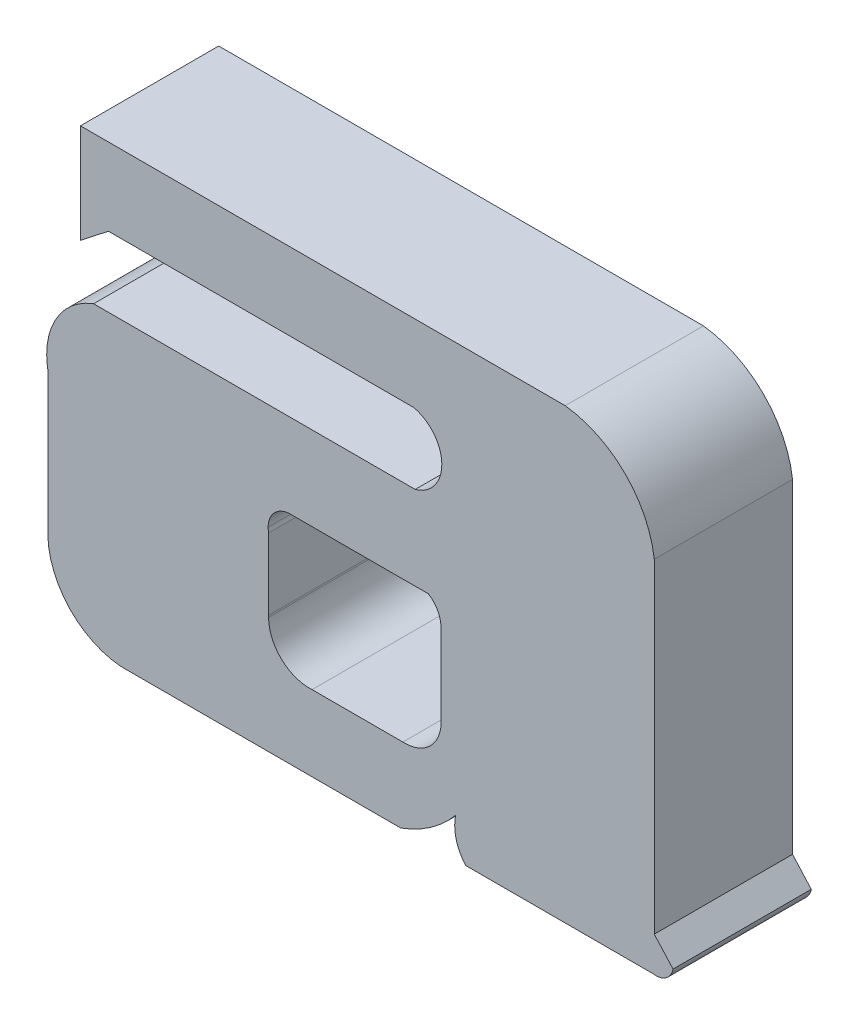
ISO-10303-21;
HEADER;
FILE_DESCRIPTION(('STEP AP214'),'2;1');
FILE_NAME('part.step','',(''),(''),'','','');
FILE_SCHEMA(('AUTOMOTIVE_DESIGN { 1 0 10303 214 1 1 1 1 }'));
ENDSEC;
DATA;
#1=APPLICATION_CONTEXT('core data for automotive mechanical design processes');
#2=APPLICATION_PROTOCOL_DEFINITION('international standard','automotive_design',2000,#1);
#3=PRODUCT_CONTEXT('',#1,'mechanical');
#4=PRODUCT('Part','Part','',(#3));
#5=PRODUCT_RELATED_PRODUCT_CATEGORY('part','',(#4));
#6=PRODUCT_DEFINITION_FORMATION('','',#4);
#7=PRODUCT_DEFINITION_CONTEXT('part definition',#1,'design');
#8=PRODUCT_DEFINITION('design','',#6,#7);
#9=PRODUCT_DEFINITION_SHAPE('','',#8);
#10=(LENGTH_UNIT() NAMED_UNIT(*) SI_UNIT(.MILLI.,.METRE.));
#11=(NAMED_UNIT(*) PLANE_ANGLE_UNIT() SI_UNIT($,.RADIAN.));
#12=(NAMED_UNIT(*) SI_UNIT($,.STERADIAN.) SOLID_ANGLE_UNIT());
#13=UNCERTAINTY_MEASURE_WITH_UNIT(LENGTH_MEASURE(1.E-05),#10,'distance_accuracy_value','');
#14=(GEOMETRIC_REPRESENTATION_CONTEXT(3) GLOBAL_UNCERTAINTY_ASSIGNED_CONTEXT((#13)) GLOBAL_UNIT_ASSIGNED_CONTEXT((#10,
#11,#12)) REPRESENTATION_CONTEXT('',''));
#15=CARTESIAN_POINT('',(0.,0.,0.));
#16=DIRECTION('',(0.,0.,1.));
#17=DIRECTION('',(1.,0.,0.));
#18=AXIS2_PLACEMENT_3D('',#15,#16,#17);
#19=CARTESIAN_POINT('',(-7.09371392000624,-18.2563641067006,69.4720552155059));
#20=DIRECTION('',(0.,0.,1.));
#21=DIRECTION('',(1.,0.,0.));
#22=AXIS2_PLACEMENT_3D('',#19,#20,#21);
#23=PLANE('',#22);
#24=DIRECTION('',(0.,-1.,0.));
#25=VECTOR('',#24,1.);
#26=CARTESIAN_POINT('',(-6.70005694437426,-17.949114577861,69.4720552155059));
#27=LINE('',#26,#25);
#28=CARTESIAN_POINT('',(-6.70005694437426,-17.949114577861,69.4720552155059));
#29=VERTEX_POINT('',#28);
#30=CARTESIAN_POINT('',(-6.70005694437426,-18.1478077512587,69.4720552155059));
#31=VERTEX_POINT('',#30);
#32=EDGE_CURVE('E249',#29,#31,#27,.T.);
#33=ORIENTED_EDGE('',*,*,#32,.T.);
#34=CARTESIAN_POINT('',(-6.58623628049664,-18.1528860307222,69.4720552155059));
#35=DIRECTION('',(0.,0.,1.));
#36=DIRECTION('',(1.,0.,0.));
#37=AXIS2_PLACEMENT_3D('',#34,#35,#36);
#38=CIRCLE('',#37,0.113933895078589);
#39=CARTESIAN_POINT('',(-6.70017017557523,-18.1528860307222,69.4720552155059));
#40=VERTEX_POINT('',#39);
#41=EDGE_CURVE('E499',#31,#40,#38,.T.);
#42=ORIENTED_EDGE('',*,*,#41,.T.);
#43=CARTESIAN_POINT('',(-6.58623628049664,-18.1528860307222,69.4720552155059));
#44=DIRECTION('',(0.,0.,1.));
#45=DIRECTION('',(1.,0.,0.));
#46=AXIS2_PLACEMENT_3D('',#43,#44,#45);
#47=CIRCLE('',#46,0.113933895078589);
#48=CARTESIAN_POINT('',(-6.57902837618529,-18.2665916970859,69.4720552155059));
#49=VERTEX_POINT('',#48);
#50=EDGE_CURVE('E11',#40,#49,#47,.T.);
#51=ORIENTED_EDGE('',*,*,#50,.T.);
#52=DIRECTION('',(1.,0.,0.));
#53=VECTOR('',#52,1.);
#54=CARTESIAN_POINT('',(-6.57902837618762,-18.2665916970863,69.4720552155059));
#55=LINE('',#54,#53);
#56=CARTESIAN_POINT('',(-6.32616518125116,-18.2665916970863,69.4720552155059));
#57=VERTEX_POINT('',#56);
#58=EDGE_CURVE('E268',#49,#57,#55,.T.);
#59=ORIENTED_EDGE('',*,*,#58,.T.);
#60=CARTESIAN_POINT('',(-6.32099396991315,-18.1653853424284,69.4720552155059));
#61=DIRECTION('',(0.,0.,1.));
#62=DIRECTION('',(1.,0.,0.));
#63=AXIS2_PLACEMENT_3D('',#60,#61,#62);
#64=CIRCLE('',#63,0.101338381918715);
#65=CARTESIAN_POINT('',(-6.22026516873313,-18.1542868622287,69.4720552155059));
#66=VERTEX_POINT('',#65);
#67=EDGE_CURVE('E318',#57,#66,#64,.T.);
#68=ORIENTED_EDGE('',*,*,#67,.T.);
#69=DIRECTION('',(0.,1.,0.));
#70=VECTOR('',#69,1.);
#71=CARTESIAN_POINT('',(-6.22026516873344,-18.1542868622284,69.4720552155059));
#72=LINE('',#71,#70);
#73=CARTESIAN_POINT('',(-6.22026516873344,-17.9404757282745,69.4720552155059));
#74=VERTEX_POINT('',#73);
#75=EDGE_CURVE('E308',#66,#74,#72,.T.);
#76=ORIENTED_EDGE('',*,*,#75,.T.);
#77=CARTESIAN_POINT('',(-6.29342149349179,-17.9361766300931,69.4720552155059));
#78=DIRECTION('',(0.,0.,1.));
#79=DIRECTION('',(1.,0.,0.));
#80=AXIS2_PLACEMENT_3D('',#77,#78,#79);
#81=CIRCLE('',#80,0.073282536101095);
#82=CARTESIAN_POINT('',(-6.25543822245236,-17.8735060531167,69.4720552155059));
#83=VERTEX_POINT('',#82);
#84=EDGE_CURVE('E292',#74,#83,#81,.T.);
#85=ORIENTED_EDGE('',*,*,#84,.T.);
#86=DIRECTION('',(-1.,0.,0.));
#87=VECTOR('',#86,1.);
#88=CARTESIAN_POINT('',(-6.25543822245267,-17.8735060531178,69.4720552155059));
#89=LINE('',#88,#87);
#90=CARTESIAN_POINT('',(-6.63422013666626,-17.8735060531178,69.4720552155059));
#91=VERTEX_POINT('',#90);
#92=EDGE_CURVE('E276',#83,#91,#89,.T.);
#93=ORIENTED_EDGE('',*,*,#92,.T.);
#94=CARTESIAN_POINT('',(-6.63863681625541,-17.9361284500337,69.4720552155059));
#95=DIRECTION('',(0.,0.,1.));
#96=DIRECTION('',(1.,0.,0.));
#97=AXIS2_PLACEMENT_3D('',#94,#95,#96);
#98=CIRCLE('',#97,0.0627779551599789);
#99=CARTESIAN_POINT('',(-6.70141477141539,-17.9361284500337,69.4720552155059));
#100=VERTEX_POINT('',#99);
#101=EDGE_CURVE('E509',#91,#100,#98,.T.);
#102=ORIENTED_EDGE('',*,*,#101,.T.);
#103=CARTESIAN_POINT('',(-6.63863681625541,-17.9361284500337,69.4720552155059));
#104=DIRECTION('',(0.,0.,1.));
#105=DIRECTION('',(1.,0.,0.));
#106=AXIS2_PLACEMENT_3D('',#103,#104,#105);
#107=CIRCLE('',#106,0.0627779551599789);
#108=EDGE_CURVE('E213',#100,#29,#107,.T.);
#109=ORIENTED_EDGE('',*,*,#108,.T.);
#110=EDGE_LOOP('',(#33,#42,#51,#59,#68,#76,#85,#93,#102,#109));
#111=FACE_BOUND('',#110,.T.);
#112=DIRECTION('',(0.,-1.,0.));
#113=VECTOR('',#112,1.);
#114=CARTESIAN_POINT('',(-7.31492985588913,-17.8625345620598,69.4720552155059));
#115=LINE('',#114,#113);
#116=CARTESIAN_POINT('',(-7.31492985588913,-17.8625345620598,69.4720552155059));
#117=VERTEX_POINT('',#116);
#118=CARTESIAN_POINT('',(-7.31492985588913,-18.2629938808058,69.4720552155059));
#119=VERTEX_POINT('',#118);
#120=EDGE_CURVE('E331',#117,#119,#115,.T.);
#121=ORIENTED_EDGE('',*,*,#120,.F.);
#122=CARTESIAN_POINT('',(-7.11852428682571,-17.8273742835004,69.4720552155059));
#123=DIRECTION('',(0.,0.,1.));
#124=DIRECTION('',(1.,0.,0.));
#125=AXIS2_PLACEMENT_3D('',#122,#123,#124);
#126=CIRCLE('',#125,0.199527924729331);
#127=CARTESIAN_POINT('',(-7.31805221155504,-17.8273742835004,69.4720552155059));
#128=VERTEX_POINT('',#127);
#129=EDGE_CURVE('E487',#128,#117,#126,.T.);
#130=ORIENTED_EDGE('',*,*,#129,.F.);
#131=CARTESIAN_POINT('',(-7.11852428682571,-17.8273742835004,69.4720552155059));
#132=DIRECTION('',(0.,0.,1.));
#133=DIRECTION('',(1.,0.,0.));
#134=AXIS2_PLACEMENT_3D('',#131,#132,#133);
#135=CIRCLE('',#134,0.199527924729331);
#136=CARTESIAN_POINT('',(-7.18748146758224,-17.6401410066266,69.4720552155059));
#137=VERTEX_POINT('',#136);
#138=EDGE_CURVE('E50',#137,#128,#135,.T.);
#139=ORIENTED_EDGE('',*,*,#138,.F.);
#140=DIRECTION('',(-1.,0.,0.));
#141=VECTOR('',#140,1.);
#142=CARTESIAN_POINT('',(-6.29181560652246,-17.6401410066266,69.4720552155059));
#143=LINE('',#142,#141);
#144=CARTESIAN_POINT('',(-6.29181560652199,-17.6401410066266,69.4720552155059));
#145=VERTEX_POINT('',#144);
#146=EDGE_CURVE('E178',#145,#137,#143,.T.);
#147=ORIENTED_EDGE('',*,*,#146,.F.);
#148=CARTESIAN_POINT('',(-6.31862845945879,-17.5428476392337,69.4720552155059));
#149=DIRECTION('',(0.,0.,-1.));
#150=DIRECTION('',(1.,0.,0.));
#151=AXIS2_PLACEMENT_3D('',#148,#149,#150);
#152=CIRCLE('',#151,0.100920406366913);
#153=CARTESIAN_POINT('',(-6.29524732166278,-17.4446730456946,69.4720552155059));
#154=VERTEX_POINT('',#153);
#155=EDGE_CURVE('E458',#154,#145,#152,.T.);
#156=ORIENTED_EDGE('',*,*,#155,.F.);
#157=DIRECTION('',(1.,0.,0.));
#158=VECTOR('',#157,1.);
#159=CARTESIAN_POINT('',(-7.14630137717123,-17.4446730456946,69.4720552155059));
#160=LINE('',#159,#158);
#161=CARTESIAN_POINT('',(-7.14630137717123,-17.4446730456946,69.4720552155059));
#162=VERTEX_POINT('',#161);
#163=EDGE_CURVE('E450',#162,#154,#160,.T.);
#164=ORIENTED_EDGE('',*,*,#163,.F.);
#165=DIRECTION('',(0.786213872145871,0.617954486386656,0.));
#166=VECTOR('',#165,1.);
#167=CARTESIAN_POINT('',(-7.22409146451037,-17.5058151027998,69.4720552155059));
#168=LINE('',#167,#166);
#169=CARTESIAN_POINT('',(-7.22409146451037,-17.5058151027998,69.4720552155059));
#170=VERTEX_POINT('',#169);
#171=EDGE_CURVE('E438',#170,#162,#168,.T.);
#172=ORIENTED_EDGE('',*,*,#171,.F.);
#173=DIRECTION('',(0.,-1.,0.));
#174=VECTOR('',#173,1.);
#175=CARTESIAN_POINT('',(-7.22409146451037,-17.2293455898983,69.4720552155059));
#176=LINE('',#175,#174);
#177=CARTESIAN_POINT('',(-7.22409146451037,-17.2293455898983,69.4720552155059));
#178=VERTEX_POINT('',#177);
#179=EDGE_CURVE('E429',#178,#170,#176,.T.);
#180=ORIENTED_EDGE('',*,*,#179,.F.);
#181=DIRECTION('',(-1.,0.,0.));
#182=VECTOR('',#181,1.);
#183=CARTESIAN_POINT('',(-5.87410051437969,-17.2293455898983,69.4720552155059));
#184=LINE('',#183,#182);
#185=CARTESIAN_POINT('',(-5.87410051437845,-17.229345589899,69.4720552155059));
#186=VERTEX_POINT('',#185);
#187=EDGE_CURVE('E417',#186,#178,#184,.T.);
#188=ORIENTED_EDGE('',*,*,#187,.F.);
#189=CARTESIAN_POINT('',(-5.9068699926172,-17.510395380675,69.4720552155059));
#190=DIRECTION('',(0.,0.,1.));
#191=DIRECTION('',(1.,0.,0.));
#192=AXIS2_PLACEMENT_3D('',#189,#190,#191);
#193=CIRCLE('',#192,0.282953748162626);
#194=CARTESIAN_POINT('',(-5.6260717122226,-17.4755363886252,69.4720552155059));
#195=VERTEX_POINT('',#194);
#196=EDGE_CURVE('E408',#195,#186,#193,.T.);
#197=ORIENTED_EDGE('',*,*,#196,.F.);
#198=DIRECTION('',(0.,1.,0.));
#199=VECTOR('',#198,1.);
#200=CARTESIAN_POINT('',(-5.6260717122226,-18.3178512836551,69.4720552155059));
#201=LINE('',#200,#199);
#202=CARTESIAN_POINT('',(-5.6260717122226,-18.3799109268185,69.4720552155059));
#203=VERTEX_POINT('',#202);
#204=EDGE_CURVE('E395',#203,#195,#201,.T.);
#205=ORIENTED_EDGE('',*,*,#204,.F.);
#206=DIRECTION('',(-0.668993054621241,0.743268654571509,0.));
#207=VECTOR('',#206,1.);
#208=CARTESIAN_POINT('',(-5.57378773528379,-18.4379997827887,69.4720552155059));
#209=LINE('',#208,#207);
#210=CARTESIAN_POINT('',(-5.5737877352813,-18.4379997827881,69.4720552155059));
#211=VERTEX_POINT('',#210);
#212=EDGE_CURVE('E300',#211,#203,#209,.T.);
#213=ORIENTED_EDGE('',*,*,#212,.F.);
#214=CARTESIAN_POINT('',(-5.62151652492824,-18.4290609792016,69.4720552155059));
#215=DIRECTION('',(0.,0.,1.));
#216=DIRECTION('',(1.,0.,0.));
#217=AXIS2_PLACEMENT_3D('',#214,#215,#216);
#218=CIRCLE('',#217,0.0485586199424548);
#219=CARTESIAN_POINT('',(-5.62962452360063,-18.476937904002,69.4720552155059));
#220=VERTEX_POINT('',#219);
#221=EDGE_CURVE('E384',#220,#211,#218,.T.);
#222=ORIENTED_EDGE('',*,*,#221,.F.);
#223=DIRECTION('',(1.,0.,0.));
#224=VECTOR('',#223,1.);
#225=CARTESIAN_POINT('',(-6.15113591884307,-18.476937904002,69.4720552155059));
#226=LINE('',#225,#224);
#227=CARTESIAN_POINT('',(-6.15113591884074,-18.4769379040006,69.4720552155059));
#228=VERTEX_POINT('',#227);
#229=EDGE_CURVE('E372',#228,#220,#226,.T.);
#230=ORIENTED_EDGE('',*,*,#229,.F.);
#231=CARTESIAN_POINT('',(-6.05953638076651,-18.3958561627307,69.4720552155059));
#232=DIRECTION('',(0.,0.,1.));
#233=DIRECTION('',(1.,0.,0.));
#234=AXIS2_PLACEMENT_3D('',#231,#232,#233);
#235=CIRCLE('',#234,0.122330389285578);
#236=CARTESIAN_POINT('',(-6.18186677005209,-18.3958561627307,69.4720552155059));
#237=VERTEX_POINT('',#236);
#238=EDGE_CURVE('E532',#237,#228,#235,.T.);
#239=ORIENTED_EDGE('',*,*,#238,.F.);
#240=CARTESIAN_POINT('',(-6.05953638076651,-18.3958561627307,69.4720552155059));
#241=DIRECTION('',(0.,0.,1.));
#242=DIRECTION('',(1.,0.,0.));
#243=AXIS2_PLACEMENT_3D('',#240,#241,#242);
#244=CIRCLE('',#243,0.122330389285578);
#245=CARTESIAN_POINT('',(-6.17895973508447,-18.3693460403971,69.4720552155059));
#246=VERTEX_POINT('',#245);
#247=EDGE_CURVE('E368',#246,#237,#244,.T.);
#248=ORIENTED_EDGE('',*,*,#247,.F.);
#249=CARTESIAN_POINT('',(-6.45231760184708,-18.1428304072885,69.4720552155059));
#250=DIRECTION('',(0.,0.,1.));
#251=DIRECTION('',(1.,0.,0.));
#252=AXIS2_PLACEMENT_3D('',#249,#250,#251);
#253=CIRCLE('',#252,0.35501247212403);
#254=CARTESIAN_POINT('',(-6.3322924544708,-18.476937904002,69.4720552155059));
#255=VERTEX_POINT('',#254);
#256=EDGE_CURVE('E260',#255,#246,#253,.T.);
#257=ORIENTED_EDGE('',*,*,#256,.F.);
#258=DIRECTION('',(1.,0.,0.));
#259=VECTOR('',#258,1.);
#260=CARTESIAN_POINT('',(-7.1118148629866,-18.476937904002,69.4720552155059));
#261=LINE('',#260,#259);
#262=CARTESIAN_POINT('',(-7.11181486298442,-18.4769379040024,69.4720552155059));
#263=VERTEX_POINT('',#262);
#264=EDGE_CURVE('E352',#263,#255,#261,.T.);
#265=ORIENTED_EDGE('',*,*,#264,.F.);
#266=CARTESIAN_POINT('',(-7.09371392000624,-18.2563641067006,69.4720552155059));
#267=DIRECTION('',(0.,0.,1.));
#268=DIRECTION('',(1.,0.,0.));
#269=AXIS2_PLACEMENT_3D('',#266,#267,#268);
#270=CIRCLE('',#269,0.221315259737904);
#271=EDGE_CURVE('E340',#119,#263,#270,.T.);
#272=ORIENTED_EDGE('',*,*,#271,.F.);
#273=EDGE_LOOP('',(#121,#130,#139,#147,#156,#164,#172,#180,#188,#197,#205,#213,#222,#230,#239,
#248,#257,#265,#272));
#274=FACE_BOUND('',#273,.T.);
#275=ADVANCED_FACE('F17',(#111,#274),#23,.F.);
#276=CARTESIAN_POINT('',(-7.09371392000624,-18.2563641067006,69.8570552155059));
#277=DIRECTION('',(0.,0.,1.));
#278=DIRECTION('',(1.,0.,0.));
#279=AXIS2_PLACEMENT_3D('',#276,#277,#278);
#280=PLANE('',#279);
#281=DIRECTION('',(0.,-1.,0.));
#282=VECTOR('',#281,1.);
#283=CARTESIAN_POINT('',(-6.70005694437426,-17.949114577861,69.8570552155059));
#284=LINE('',#283,#282);
#285=CARTESIAN_POINT('',(-6.70005694437426,-17.949114577861,69.8570552155059));
#286=VERTEX_POINT('',#285);
#287=CARTESIAN_POINT('',(-6.70005694437426,-18.1478077512587,69.8570552155059));
#288=VERTEX_POINT('',#287);
#289=EDGE_CURVE('E233',#286,#288,#284,.T.);
#290=ORIENTED_EDGE('',*,*,#289,.F.);
#291=CARTESIAN_POINT('',(-6.63863681625541,-17.9361284500337,69.8570552155059));
#292=DIRECTION('',(0.,0.,1.));
#293=DIRECTION('',(0.,-1.,0.));
#294=AXIS2_PLACEMENT_3D('',#291,#292,#293);
#295=CIRCLE('',#294,0.0627779551599789);
#296=CARTESIAN_POINT('',(-6.70141477141539,-17.9361284500337,69.8570552155059));
#297=VERTEX_POINT('',#296);
#298=EDGE_CURVE('E220',#297,#286,#295,.T.);
#299=ORIENTED_EDGE('',*,*,#298,.F.);
#300=CARTESIAN_POINT('',(-6.63863681625541,-17.9361284500337,69.8570552155059));
#301=DIRECTION('',(0.,0.,1.));
#302=DIRECTION('',(0.,-1.,0.));
#303=AXIS2_PLACEMENT_3D('',#300,#301,#302);
#304=CIRCLE('',#303,0.0627779551599789);
#305=CARTESIAN_POINT('',(-6.63422013666626,-17.8735060531178,69.8570552155059));
#306=VERTEX_POINT('',#305);
#307=EDGE_CURVE('E510',#306,#297,#304,.T.);
#308=ORIENTED_EDGE('',*,*,#307,.F.);
#309=DIRECTION('',(-1.,0.,0.));
#310=VECTOR('',#309,1.);
#311=CARTESIAN_POINT('',(-6.25543822245267,-17.8735060531178,69.8570552155059));
#312=LINE('',#311,#310);
#313=CARTESIAN_POINT('',(-6.25543822245236,-17.8735060531167,69.8570552155059));
#314=VERTEX_POINT('',#313);
#315=EDGE_CURVE('E286',#314,#306,#312,.T.);
#316=ORIENTED_EDGE('',*,*,#315,.F.);
#317=CARTESIAN_POINT('',(-6.29342149349179,-17.9361766300931,69.8570552155059));
#318=DIRECTION('',(0.,0.,1.));
#319=DIRECTION('',(0.,-1.,0.));
#320=AXIS2_PLACEMENT_3D('',#317,#318,#319);
#321=CIRCLE('',#320,0.073282536101095);
#322=CARTESIAN_POINT('',(-6.22026516873344,-17.9404757282745,69.8570552155059));
#323=VERTEX_POINT('',#322);
#324=EDGE_CURVE('E305',#323,#314,#321,.T.);
#325=ORIENTED_EDGE('',*,*,#324,.F.);
#326=DIRECTION('',(0.,1.,0.));
#327=VECTOR('',#326,1.);
#328=CARTESIAN_POINT('',(-6.22026516873344,-18.1542868622284,69.8570552155059));
#329=LINE('',#328,#327);
#330=CARTESIAN_POINT('',(-6.22026516873313,-18.1542868622287,69.8570552155059));
#331=VERTEX_POINT('',#330);
#332=EDGE_CURVE('E314',#331,#323,#329,.T.);
#333=ORIENTED_EDGE('',*,*,#332,.F.);
#334=CARTESIAN_POINT('',(-6.32099396991315,-18.1653853424284,69.8570552155059));
#335=DIRECTION('',(0.,0.,1.));
#336=DIRECTION('',(0.,-1.,0.));
#337=AXIS2_PLACEMENT_3D('',#334,#335,#336);
#338=CIRCLE('',#337,0.101338381918715);
#339=CARTESIAN_POINT('',(-6.32616518125116,-18.2665916970863,69.8570552155059));
#340=VERTEX_POINT('',#339);
#341=EDGE_CURVE('E273',#340,#331,#338,.T.);
#342=ORIENTED_EDGE('',*,*,#341,.F.);
#343=DIRECTION('',(1.,0.,0.));
#344=VECTOR('',#343,1.);
#345=CARTESIAN_POINT('',(-6.57902837618762,-18.2665916970863,69.8570552155059));
#346=LINE('',#345,#344);
#347=CARTESIAN_POINT('',(-6.57902837618529,-18.2665916970859,69.8570552155059));
#348=VERTEX_POINT('',#347);
#349=EDGE_CURVE('E328',#348,#340,#346,.T.);
#350=ORIENTED_EDGE('',*,*,#349,.F.);
#351=CARTESIAN_POINT('',(-6.58623628049664,-18.1528860307222,69.8570552155059));
#352=DIRECTION('',(0.,0.,1.));
#353=DIRECTION('',(0.,-1.,0.));
#354=AXIS2_PLACEMENT_3D('',#351,#352,#353);
#355=CIRCLE('',#354,0.113933895078588);
#356=CARTESIAN_POINT('',(-6.70017017557523,-18.1528860307222,69.8570552155059));
#357=VERTEX_POINT('',#356);
#358=EDGE_CURVE('E20',#357,#348,#355,.T.);
#359=ORIENTED_EDGE('',*,*,#358,.F.);
#360=CARTESIAN_POINT('',(-6.58623628049664,-18.1528860307222,69.8570552155059));
#361=DIRECTION('',(0.,0.,1.));
#362=DIRECTION('',(0.,-1.,0.));
#363=AXIS2_PLACEMENT_3D('',#360,#361,#362);
#364=CIRCLE('',#363,0.113933895078588);
#365=EDGE_CURVE('E242',#288,#357,#364,.T.);
#366=ORIENTED_EDGE('',*,*,#365,.F.);
#367=EDGE_LOOP('',(#290,#299,#308,#316,#325,#333,#342,#350,#359,#366));
#368=FACE_BOUND('',#367,.T.);
#369=DIRECTION('',(0.,-1.,0.));
#370=VECTOR('',#369,1.);
#371=CARTESIAN_POINT('',(-7.31492985588913,-17.8625345620598,69.8570552155059));
#372=LINE('',#371,#370);
#373=CARTESIAN_POINT('',(-7.31492985588913,-17.8625345620598,69.8570552155059));
#374=VERTEX_POINT('',#373);
#375=CARTESIAN_POINT('',(-7.31492985588913,-18.2629938808058,69.8570552155059));
#376=VERTEX_POINT('',#375);
#377=EDGE_CURVE('E336',#374,#376,#372,.T.);
#378=ORIENTED_EDGE('',*,*,#377,.T.);
#379=CARTESIAN_POINT('',(-7.09371392000624,-18.2563641067006,69.8570552155059));
#380=DIRECTION('',(0.,0.,1.));
#381=DIRECTION('',(0.,-1.,0.));
#382=AXIS2_PLACEMENT_3D('',#379,#380,#381);
#383=CIRCLE('',#382,0.221315259737905);
#384=CARTESIAN_POINT('',(-7.11181486298442,-18.4769379040024,69.8570552155059));
#385=VERTEX_POINT('',#384);
#386=EDGE_CURVE('E348',#376,#385,#383,.T.);
#387=ORIENTED_EDGE('',*,*,#386,.T.);
#388=DIRECTION('',(1.,0.,0.));
#389=VECTOR('',#388,1.);
#390=CARTESIAN_POINT('',(-7.1118148629866,-18.476937904002,69.8570552155059));
#391=LINE('',#390,#389);
#392=CARTESIAN_POINT('',(-6.3322924544708,-18.476937904002,69.8570552155059));
#393=VERTEX_POINT('',#392);
#394=EDGE_CURVE('E360',#385,#393,#391,.T.);
#395=ORIENTED_EDGE('',*,*,#394,.T.);
#396=CARTESIAN_POINT('',(-6.45231760184708,-18.1428304072885,69.8570552155059));
#397=DIRECTION('',(0.,0.,1.));
#398=DIRECTION('',(0.,-1.,0.));
#399=AXIS2_PLACEMENT_3D('',#396,#397,#398);
#400=CIRCLE('',#399,0.355012472124029);
#401=CARTESIAN_POINT('',(-6.17895973508447,-18.3693460403971,69.8570552155059));
#402=VERTEX_POINT('',#401);
#403=EDGE_CURVE('E263',#393,#402,#400,.T.);
#404=ORIENTED_EDGE('',*,*,#403,.T.);
#405=CARTESIAN_POINT('',(-6.05953638076651,-18.3958561627307,69.8570552155059));
#406=DIRECTION('',(0.,0.,1.));
#407=DIRECTION('',(0.,-1.,0.));
#408=AXIS2_PLACEMENT_3D('',#405,#406,#407);
#409=CIRCLE('',#408,0.122330389285576);
#410=CARTESIAN_POINT('',(-6.18186677005209,-18.3958561627307,69.8570552155059));
#411=VERTEX_POINT('',#410);
#412=EDGE_CURVE('E367',#402,#411,#409,.T.);
#413=ORIENTED_EDGE('',*,*,#412,.T.);
#414=CARTESIAN_POINT('',(-6.05953638076651,-18.3958561627307,69.8570552155059));
#415=DIRECTION('',(0.,0.,1.));
#416=DIRECTION('',(0.,-1.,0.));
#417=AXIS2_PLACEMENT_3D('',#414,#415,#416);
#418=CIRCLE('',#417,0.122330389285576);
#419=CARTESIAN_POINT('',(-6.15113591884074,-18.4769379040006,69.8570552155059));
#420=VERTEX_POINT('',#419);
#421=EDGE_CURVE('E520',#411,#420,#418,.T.);
#422=ORIENTED_EDGE('',*,*,#421,.T.);
#423=DIRECTION('',(1.,0.,0.));
#424=VECTOR('',#423,1.);
#425=CARTESIAN_POINT('',(-6.15113591884307,-18.476937904002,69.8570552155059));
#426=LINE('',#425,#424);
#427=CARTESIAN_POINT('',(-5.62962452360063,-18.476937904002,69.8570552155059));
#428=VERTEX_POINT('',#427);
#429=EDGE_CURVE('E380',#420,#428,#426,.T.);
#430=ORIENTED_EDGE('',*,*,#429,.T.);
#431=CARTESIAN_POINT('',(-5.62151652492824,-18.4290609792016,69.8570552155059));
#432=DIRECTION('',(0.,0.,1.));
#433=DIRECTION('',(0.,-1.,0.));
#434=AXIS2_PLACEMENT_3D('',#431,#432,#433);
#435=CIRCLE('',#434,0.0485586199424556);
#436=CARTESIAN_POINT('',(-5.5737877352813,-18.4379997827881,69.8570552155059));
#437=VERTEX_POINT('',#436);
#438=EDGE_CURVE('E296',#428,#437,#435,.T.);
#439=ORIENTED_EDGE('',*,*,#438,.T.);
#440=DIRECTION('',(-0.668993054621241,0.743268654571509,0.));
#441=VECTOR('',#440,1.);
#442=CARTESIAN_POINT('',(-5.57378773528379,-18.4379997827887,69.8570552155059));
#443=LINE('',#442,#441);
#444=CARTESIAN_POINT('',(-5.6260717122226,-18.3799109268185,69.8570552155059));
#445=VERTEX_POINT('',#444);
#446=EDGE_CURVE('E391',#437,#445,#443,.T.);
#447=ORIENTED_EDGE('',*,*,#446,.T.);
#448=DIRECTION('',(0.,1.,0.));
#449=VECTOR('',#448,1.);
#450=CARTESIAN_POINT('',(-5.6260717122226,-18.3178512836551,69.8570552155059));
#451=LINE('',#450,#449);
#452=CARTESIAN_POINT('',(-5.6260717122226,-17.4755363886252,69.8570552155059));
#453=VERTEX_POINT('',#452);
#454=EDGE_CURVE('E404',#445,#453,#451,.T.);
#455=ORIENTED_EDGE('',*,*,#454,.T.);
#456=CARTESIAN_POINT('',(-5.9068699926172,-17.510395380675,69.8570552155059));
#457=DIRECTION('',(0.,0.,1.));
#458=DIRECTION('',(0.,-1.,0.));
#459=AXIS2_PLACEMENT_3D('',#456,#457,#458);
#460=CIRCLE('',#459,0.282953748162625);
#461=CARTESIAN_POINT('',(-5.87410051437845,-17.229345589899,69.8570552155059));
#462=VERTEX_POINT('',#461);
#463=EDGE_CURVE('E416',#453,#462,#460,.T.);
#464=ORIENTED_EDGE('',*,*,#463,.T.);
#465=DIRECTION('',(-1.,0.,0.));
#466=VECTOR('',#465,1.);
#467=CARTESIAN_POINT('',(-5.87410051437969,-17.2293455898983,69.8570552155059));
#468=LINE('',#467,#466);
#469=CARTESIAN_POINT('',(-7.22409146451037,-17.2293455898983,69.8570552155059));
#470=VERTEX_POINT('',#469);
#471=EDGE_CURVE('E425',#462,#470,#468,.T.);
#472=ORIENTED_EDGE('',*,*,#471,.T.);
#473=DIRECTION('',(0.,-1.,0.));
#474=VECTOR('',#473,1.);
#475=CARTESIAN_POINT('',(-7.22409146451037,-17.2293455898983,69.8570552155059));
#476=LINE('',#475,#474);
#477=CARTESIAN_POINT('',(-7.22409146451037,-17.5058151027998,69.8570552155059));
#478=VERTEX_POINT('',#477);
#479=EDGE_CURVE('E437',#470,#478,#476,.T.);
#480=ORIENTED_EDGE('',*,*,#479,.T.);
#481=DIRECTION('',(0.786213872145872,0.617954486386656,0.));
#482=VECTOR('',#481,1.);
#483=CARTESIAN_POINT('',(-7.22409146451037,-17.5058151027998,69.8570552155059));
#484=LINE('',#483,#482);
#485=CARTESIAN_POINT('',(-7.14630137717123,-17.4446730456946,69.8570552155059));
#486=VERTEX_POINT('',#485);
#487=EDGE_CURVE('E446',#478,#486,#484,.T.);
#488=ORIENTED_EDGE('',*,*,#487,.T.);
#489=DIRECTION('',(1.,0.,0.));
#490=VECTOR('',#489,1.);
#491=CARTESIAN_POINT('',(-7.14630137717123,-17.4446730456946,69.8570552155059));
#492=LINE('',#491,#490);
#493=CARTESIAN_POINT('',(-6.29524732166278,-17.4446730456946,69.8570552155059));
#494=VERTEX_POINT('',#493);
#495=EDGE_CURVE('E457',#486,#494,#492,.T.);
#496=ORIENTED_EDGE('',*,*,#495,.T.);
#497=CARTESIAN_POINT('',(-6.31862845945879,-17.5428476392337,69.8570552155059));
#498=DIRECTION('',(0.,0.,-1.));
#499=DIRECTION('',(0.,-1.,0.));
#500=AXIS2_PLACEMENT_3D('',#497,#498,#499);
#501=CIRCLE('',#500,0.100920406366913);
#502=CARTESIAN_POINT('',(-6.29181560652199,-17.6401410066266,69.8570552155059));
#503=VERTEX_POINT('',#502);
#504=EDGE_CURVE('E191',#494,#503,#501,.T.);
#505=ORIENTED_EDGE('',*,*,#504,.T.);
#506=DIRECTION('',(-1.,0.,0.));
#507=VECTOR('',#506,1.);
#508=CARTESIAN_POINT('',(-6.29181560652246,-17.6401410066266,69.8570552155059));
#509=LINE('',#508,#507);
#510=CARTESIAN_POINT('',(-7.18748146758224,-17.6401410066266,69.8570552155059));
#511=VERTEX_POINT('',#510);
#512=EDGE_CURVE('E277',#503,#511,#509,.T.);
#513=ORIENTED_EDGE('',*,*,#512,.T.);
#514=CARTESIAN_POINT('',(-7.11852428682571,-17.8273742835004,69.8570552155059));
#515=DIRECTION('',(0.,0.,1.));
#516=DIRECTION('',(0.,-1.,0.));
#517=AXIS2_PLACEMENT_3D('',#514,#515,#516);
#518=CIRCLE('',#517,0.199527924729329);
#519=CARTESIAN_POINT('',(-7.31805221155504,-17.8273742835004,69.8570552155059));
#520=VERTEX_POINT('',#519);
#521=EDGE_CURVE('E37',#511,#520,#518,.T.);
#522=ORIENTED_EDGE('',*,*,#521,.T.);
#523=CARTESIAN_POINT('',(-7.11852428682571,-17.8273742835004,69.8570552155059));
#524=DIRECTION('',(0.,0.,1.));
#525=DIRECTION('',(0.,-1.,0.));
#526=AXIS2_PLACEMENT_3D('',#523,#524,#525);
#527=CIRCLE('',#526,0.199527924729329);
#528=EDGE_CURVE('E475',#520,#374,#527,.T.);
#529=ORIENTED_EDGE('',*,*,#528,.T.);
#530=EDGE_LOOP('',(#378,#387,#395,#404,#413,#422,#430,#439,#447,#455,#464,#472,#480,#488,#496,
#505,#513,#522,#529));
#531=FACE_BOUND('',#530,.T.);
#532=ADVANCED_FACE('F237',(#368,#531),#280,.T.);
#533=CARTESIAN_POINT('',(-6.58623628049664,-18.1528860307222,69.8220552155059));
#534=DIRECTION('',(0.,0.,-1.));
#535=DIRECTION('',(-1.,0.,0.));
#536=AXIS2_PLACEMENT_3D('',#533,#534,#535);
#537=CYLINDRICAL_SURFACE('',#536,0.113933895078589);
#538=DIRECTION('',(0.,0.,-1.));
#539=VECTOR('',#538,1.);
#540=CARTESIAN_POINT('',(-6.70017017557523,-18.1528860307222,69.8220552155059));
#541=LINE('',#540,#539);
#542=EDGE_CURVE('E657',#357,#40,#541,.T.);
#543=ORIENTED_EDGE('',*,*,#542,.F.);
#544=ORIENTED_EDGE('',*,*,#358,.T.);
#545=DIRECTION('',(0.,0.,-1.));
#546=VECTOR('',#545,1.);
#547=CARTESIAN_POINT('',(-6.57902837618529,-18.2665916970859,69.8220552155059));
#548=LINE('',#547,#546);
#549=EDGE_CURVE('E272',#348,#49,#548,.T.);
#550=ORIENTED_EDGE('',*,*,#549,.T.);
#551=ORIENTED_EDGE('',*,*,#50,.F.);
#552=EDGE_LOOP('',(#543,#544,#550,#551));
#553=FACE_BOUND('',#552,.T.);
#554=ADVANCED_FACE('F724',(#553),#537,.F.);
#555=CARTESIAN_POINT('',(-7.11852428682571,-17.8273742835004,69.8220552155059));
#556=DIRECTION('',(0.,0.,-1.));
#557=DIRECTION('',(-1.,0.,0.));
#558=AXIS2_PLACEMENT_3D('',#555,#556,#557);
#559=CYLINDRICAL_SURFACE('',#558,0.199527924729331);
#560=DIRECTION('',(0.,0.,-1.));
#561=VECTOR('',#560,1.);
#562=CARTESIAN_POINT('',(-7.31805221155504,-17.8273742835004,69.8220552155059));
#563=LINE('',#562,#561);
#564=EDGE_CURVE('E481',#520,#128,#563,.T.);
#565=ORIENTED_EDGE('',*,*,#564,.F.);
#566=ORIENTED_EDGE('',*,*,#521,.F.);
#567=DIRECTION('',(0.,0.,-1.));
#568=VECTOR('',#567,1.);
#569=CARTESIAN_POINT('',(-7.18748146758224,-17.6401410066266,69.8220552155059));
#570=LINE('',#569,#568);
#571=EDGE_CURVE('E266',#511,#137,#570,.T.);
#572=ORIENTED_EDGE('',*,*,#571,.T.);
#573=ORIENTED_EDGE('',*,*,#138,.T.);
#574=EDGE_LOOP('',(#565,#566,#572,#573));
#575=FACE_BOUND('',#574,.T.);
#576=ADVANCED_FACE('F482',(#575),#559,.T.);
#577=CARTESIAN_POINT('',(-6.29181560652246,-17.6401410066266,69.8220552155059));
#578=DIRECTION('',(0.,-1.,0.));
#579=DIRECTION('',(0.,0.,-1.));
#580=AXIS2_PLACEMENT_3D('',#577,#578,#579);
#581=PLANE('',#580);
#582=ORIENTED_EDGE('',*,*,#146,.T.);
#583=ORIENTED_EDGE('',*,*,#571,.F.);
#584=ORIENTED_EDGE('',*,*,#512,.F.);
#585=DIRECTION('',(0.,0.,-1.));
#586=VECTOR('',#585,1.);
#587=CARTESIAN_POINT('',(-6.29181560652199,-17.6401410066266,69.8220552155059));
#588=LINE('',#587,#586);
#589=EDGE_CURVE('E462',#503,#145,#588,.T.);
#590=ORIENTED_EDGE('',*,*,#589,.T.);
#591=EDGE_LOOP('',(#582,#583,#584,#590));
#592=FACE_BOUND('',#591,.T.);
#593=ADVANCED_FACE('F736',(#592),#581,.F.);
#594=CARTESIAN_POINT('',(-6.31862845945879,-17.5428476392337,69.8220552155059));
#595=DIRECTION('',(0.,0.,-1.));
#596=DIRECTION('',(-1.,0.,0.));
#597=AXIS2_PLACEMENT_3D('',#594,#595,#596);
#598=CYLINDRICAL_SURFACE('',#597,0.100920406366913);
#599=ORIENTED_EDGE('',*,*,#155,.T.);
#600=ORIENTED_EDGE('',*,*,#589,.F.);
#601=ORIENTED_EDGE('',*,*,#504,.F.);
#602=DIRECTION('',(0.,0.,-1.));
#603=VECTOR('',#602,1.);
#604=CARTESIAN_POINT('',(-6.29524732166278,-17.4446730456946,69.8220552155059));
#605=LINE('',#604,#603);
#606=EDGE_CURVE('E454',#494,#154,#605,.T.);
#607=ORIENTED_EDGE('',*,*,#606,.T.);
#608=EDGE_LOOP('',(#599,#600,#601,#607));
#609=FACE_BOUND('',#608,.T.);
#610=ADVANCED_FACE('F741',(#609),#598,.F.);
#611=CARTESIAN_POINT('',(-7.14630137717123,-17.4446730456946,69.8220552155059));
#612=DIRECTION('',(0.,1.,0.));
#613=DIRECTION('',(1.,0.,0.));
#614=AXIS2_PLACEMENT_3D('',#611,#612,#613);
#615=PLANE('',#614);
#616=ORIENTED_EDGE('',*,*,#163,.T.);
#617=ORIENTED_EDGE('',*,*,#606,.F.);
#618=ORIENTED_EDGE('',*,*,#495,.F.);
#619=DIRECTION('',(0.,0.,-1.));
#620=VECTOR('',#619,1.);
#621=CARTESIAN_POINT('',(-7.14630137717123,-17.4446730456946,69.8220552155059));
#622=LINE('',#621,#620);
#623=EDGE_CURVE('E442',#486,#162,#622,.T.);
#624=ORIENTED_EDGE('',*,*,#623,.T.);
#625=EDGE_LOOP('',(#616,#617,#618,#624));
#626=FACE_BOUND('',#625,.T.);
#627=ADVANCED_FACE('F751',(#626),#615,.F.);
#628=CARTESIAN_POINT('',(-7.22409146451037,-17.5058151027998,69.8220552155059));
#629=DIRECTION('',(-0.617954486386656,0.786213872145871,0.));
#630=DIRECTION('',(0.,0.,1.));
#631=AXIS2_PLACEMENT_3D('',#628,#629,#630);
#632=PLANE('',#631);
#633=ORIENTED_EDGE('',*,*,#171,.T.);
#634=ORIENTED_EDGE('',*,*,#623,.F.);
#635=ORIENTED_EDGE('',*,*,#487,.F.);
#636=DIRECTION('',(0.,0.,-1.));
#637=VECTOR('',#636,1.);
#638=CARTESIAN_POINT('',(-7.22409146451037,-17.5058151027998,69.8220552155059));
#639=LINE('',#638,#637);
#640=EDGE_CURVE('E433',#478,#170,#639,.T.);
#641=ORIENTED_EDGE('',*,*,#640,.T.);
#642=EDGE_LOOP('',(#633,#634,#635,#641));
#643=FACE_BOUND('',#642,.T.);
#644=ADVANCED_FACE('F756',(#643),#632,.F.);
#645=CARTESIAN_POINT('',(-7.22409146451037,-17.2293455898983,69.8220552155059));
#646=DIRECTION('',(1.,0.,0.));
#647=DIRECTION('',(0.,1.,0.));
#648=AXIS2_PLACEMENT_3D('',#645,#646,#647);
#649=PLANE('',#648);
#650=ORIENTED_EDGE('',*,*,#179,.T.);
#651=ORIENTED_EDGE('',*,*,#640,.F.);
#652=ORIENTED_EDGE('',*,*,#479,.F.);
#653=DIRECTION('',(0.,0.,-1.));
#654=VECTOR('',#653,1.);
#655=CARTESIAN_POINT('',(-7.22409146451037,-17.2293455898983,69.8220552155059));
#656=LINE('',#655,#654);
#657=EDGE_CURVE('E421',#470,#178,#656,.T.);
#658=ORIENTED_EDGE('',*,*,#657,.T.);
#659=EDGE_LOOP('',(#650,#651,#652,#658));
#660=FACE_BOUND('',#659,.T.);
#661=ADVANCED_FACE('F650',(#660),#649,.F.);
#662=CARTESIAN_POINT('',(-5.87410051437969,-17.2293455898983,69.8220552155059));
#663=DIRECTION('',(0.,-1.,0.));
#664=DIRECTION('',(0.,0.,-1.));
#665=AXIS2_PLACEMENT_3D('',#662,#663,#664);
#666=PLANE('',#665);
#667=ORIENTED_EDGE('',*,*,#187,.T.);
#668=ORIENTED_EDGE('',*,*,#657,.F.);
#669=ORIENTED_EDGE('',*,*,#471,.F.);
#670=DIRECTION('',(0.,0.,-1.));
#671=VECTOR('',#670,1.);
#672=CARTESIAN_POINT('',(-5.87410051437845,-17.229345589899,69.8220552155059));
#673=LINE('',#672,#671);
#674=EDGE_CURVE('E412',#462,#186,#673,.T.);
#675=ORIENTED_EDGE('',*,*,#674,.T.);
#676=EDGE_LOOP('',(#667,#668,#669,#675));
#677=FACE_BOUND('',#676,.T.);
#678=ADVANCED_FACE('F648',(#677),#666,.F.);
#679=CARTESIAN_POINT('',(-5.9068699926172,-17.510395380675,69.8220552155059));
#680=DIRECTION('',(0.,0.,-1.));
#681=DIRECTION('',(-1.,0.,0.));
#682=AXIS2_PLACEMENT_3D('',#679,#680,#681);
#683=CYLINDRICAL_SURFACE('',#682,0.282953748162626);
#684=ORIENTED_EDGE('',*,*,#196,.T.);
#685=ORIENTED_EDGE('',*,*,#674,.F.);
#686=ORIENTED_EDGE('',*,*,#463,.F.);
#687=DIRECTION('',(0.,0.,-1.));
#688=VECTOR('',#687,1.);
#689=CARTESIAN_POINT('',(-5.6260717122226,-17.4755363886252,69.8220552155059));
#690=LINE('',#689,#688);
#691=EDGE_CURVE('E400',#453,#195,#690,.T.);
#692=ORIENTED_EDGE('',*,*,#691,.T.);
#693=EDGE_LOOP('',(#684,#685,#686,#692));
#694=FACE_BOUND('',#693,.T.);
#695=ADVANCED_FACE('F646',(#694),#683,.T.);
#696=CARTESIAN_POINT('',(-5.6260717122226,-18.3178512836551,69.8220552155059));
#697=DIRECTION('',(-1.,0.,0.));
#698=DIRECTION('',(0.,0.,1.));
#699=AXIS2_PLACEMENT_3D('',#696,#697,#698);
#700=PLANE('',#699);
#701=ORIENTED_EDGE('',*,*,#204,.T.);
#702=ORIENTED_EDGE('',*,*,#691,.F.);
#703=ORIENTED_EDGE('',*,*,#454,.F.);
#704=DIRECTION('',(0.,0.,-1.));
#705=VECTOR('',#704,1.);
#706=CARTESIAN_POINT('',(-5.6260717122226,-18.3799109268185,69.8220552155059));
#707=LINE('',#706,#705);
#708=EDGE_CURVE('E396',#445,#203,#707,.T.);
#709=ORIENTED_EDGE('',*,*,#708,.T.);
#710=EDGE_LOOP('',(#701,#702,#703,#709));
#711=FACE_BOUND('',#710,.T.);
#712=ADVANCED_FACE('F640',(#711),#700,.F.);
#713=CARTESIAN_POINT('',(-5.57378773528379,-18.4379997827887,69.8220552155059));
#714=DIRECTION('',(-0.743268654571509,-0.668993054621241,0.));
#715=DIRECTION('',(-0.668993054621241,0.743268654571509,0.));
#716=AXIS2_PLACEMENT_3D('',#713,#714,#715);
#717=PLANE('',#716);
#718=ORIENTED_EDGE('',*,*,#212,.T.);
#719=ORIENTED_EDGE('',*,*,#708,.F.);
#720=ORIENTED_EDGE('',*,*,#446,.F.);
#721=DIRECTION('',(0.,0.,-1.));
#722=VECTOR('',#721,1.);
#723=CARTESIAN_POINT('',(-5.5737877352813,-18.4379997827881,69.8220552155059));
#724=LINE('',#723,#722);
#725=EDGE_CURVE('E301',#437,#211,#724,.T.);
#726=ORIENTED_EDGE('',*,*,#725,.T.);
#727=EDGE_LOOP('',(#718,#719,#720,#726));
#728=FACE_BOUND('',#727,.T.);
#729=ADVANCED_FACE('F637',(#728),#717,.F.);
#730=CARTESIAN_POINT('',(-5.62151652492824,-18.4290609792016,69.8220552155059));
#731=DIRECTION('',(0.,0.,-1.));
#732=DIRECTION('',(-1.,0.,0.));
#733=AXIS2_PLACEMENT_3D('',#730,#731,#732);
#734=CYLINDRICAL_SURFACE('',#733,0.0485586199424548);
#735=ORIENTED_EDGE('',*,*,#221,.T.);
#736=ORIENTED_EDGE('',*,*,#725,.F.);
#737=ORIENTED_EDGE('',*,*,#438,.F.);
#738=DIRECTION('',(0.,0.,-1.));
#739=VECTOR('',#738,1.);
#740=CARTESIAN_POINT('',(-5.62962452360063,-18.476937904002,69.8220552155059));
#741=LINE('',#740,#739);
#742=EDGE_CURVE('E376',#428,#220,#741,.T.);
#743=ORIENTED_EDGE('',*,*,#742,.T.);
#744=EDGE_LOOP('',(#735,#736,#737,#743));
#745=FACE_BOUND('',#744,.T.);
#746=ADVANCED_FACE('F634',(#745),#734,.T.);
#747=CARTESIAN_POINT('',(-6.15113591884307,-18.476937904002,69.8220552155059));
#748=DIRECTION('',(0.,1.,0.));
#749=DIRECTION('',(1.,0.,0.));
#750=AXIS2_PLACEMENT_3D('',#747,#748,#749);
#751=PLANE('',#750);
#752=ORIENTED_EDGE('',*,*,#229,.T.);
#753=ORIENTED_EDGE('',*,*,#742,.F.);
#754=ORIENTED_EDGE('',*,*,#429,.F.);
#755=DIRECTION('',(0.,0.,-1.));
#756=VECTOR('',#755,1.);
#757=CARTESIAN_POINT('',(-6.15113591884074,-18.4769379040006,69.8220552155059));
#758=LINE('',#757,#756);
#759=EDGE_CURVE('E528',#420,#228,#758,.T.);
#760=ORIENTED_EDGE('',*,*,#759,.T.);
#761=EDGE_LOOP('',(#752,#753,#754,#760));
#762=FACE_BOUND('',#761,.T.);
#763=ADVANCED_FACE('F629',(#762),#751,.F.);
#764=CARTESIAN_POINT('',(-6.05953638076651,-18.3958561627307,69.8220552155059));
#765=DIRECTION('',(0.,0.,-1.));
#766=DIRECTION('',(-1.,0.,0.));
#767=AXIS2_PLACEMENT_3D('',#764,#765,#766);
#768=CYLINDRICAL_SURFACE('',#767,0.122330389285578);
#769=DIRECTION('',(0.,0.,-1.));
#770=VECTOR('',#769,1.);
#771=CARTESIAN_POINT('',(-6.18186677005209,-18.3958561627307,69.8220552155059));
#772=LINE('',#771,#770);
#773=EDGE_CURVE('E524',#411,#237,#772,.T.);
#774=ORIENTED_EDGE('',*,*,#773,.F.);
#775=ORIENTED_EDGE('',*,*,#412,.F.);
#776=DIRECTION('',(0.,0.,-1.));
#777=VECTOR('',#776,1.);
#778=CARTESIAN_POINT('',(-6.17895973508447,-18.3693460403971,69.8220552155059));
#779=LINE('',#778,#777);
#780=EDGE_CURVE('E261',#402,#246,#779,.T.);
#781=ORIENTED_EDGE('',*,*,#780,.T.);
#782=ORIENTED_EDGE('',*,*,#247,.T.);
#783=EDGE_LOOP('',(#774,#775,#781,#782));
#784=FACE_BOUND('',#783,.T.);
#785=ADVANCED_FACE('F621',(#784),#768,.T.);
#786=CARTESIAN_POINT('',(-6.45231760184708,-18.1428304072885,69.8220552155059));
#787=DIRECTION('',(0.,0.,-1.));
#788=DIRECTION('',(-1.,0.,0.));
#789=AXIS2_PLACEMENT_3D('',#786,#787,#788);
#790=CYLINDRICAL_SURFACE('',#789,0.35501247212403);
#791=ORIENTED_EDGE('',*,*,#256,.T.);
#792=ORIENTED_EDGE('',*,*,#780,.F.);
#793=ORIENTED_EDGE('',*,*,#403,.F.);
#794=DIRECTION('',(0.,0.,-1.));
#795=VECTOR('',#794,1.);
#796=CARTESIAN_POINT('',(-6.3322924544708,-18.476937904002,69.8220552155059));
#797=LINE('',#796,#795);
#798=EDGE_CURVE('E356',#393,#255,#797,.T.);
#799=ORIENTED_EDGE('',*,*,#798,.T.);
#800=EDGE_LOOP('',(#791,#792,#793,#799));
#801=FACE_BOUND('',#800,.T.);
#802=ADVANCED_FACE('F617',(#801),#790,.T.);
#803=CARTESIAN_POINT('',(-7.1118148629866,-18.476937904002,69.8220552155059));
#804=DIRECTION('',(0.,1.,0.));
#805=DIRECTION('',(1.,0.,0.));
#806=AXIS2_PLACEMENT_3D('',#803,#804,#805);
#807=PLANE('',#806);
#808=ORIENTED_EDGE('',*,*,#264,.T.);
#809=ORIENTED_EDGE('',*,*,#798,.F.);
#810=ORIENTED_EDGE('',*,*,#394,.F.);
#811=DIRECTION('',(0.,0.,-1.));
#812=VECTOR('',#811,1.);
#813=CARTESIAN_POINT('',(-7.11181486298442,-18.4769379040024,69.8220552155059));
#814=LINE('',#813,#812);
#815=EDGE_CURVE('E344',#385,#263,#814,.T.);
#816=ORIENTED_EDGE('',*,*,#815,.T.);
#817=EDGE_LOOP('',(#808,#809,#810,#816));
#818=FACE_BOUND('',#817,.T.);
#819=ADVANCED_FACE('F614',(#818),#807,.F.);
#820=CARTESIAN_POINT('',(-7.09371392000624,-18.2563641067006,69.8220552155059));
#821=DIRECTION('',(0.,0.,-1.));
#822=DIRECTION('',(-1.,0.,0.));
#823=AXIS2_PLACEMENT_3D('',#820,#821,#822);
#824=CYLINDRICAL_SURFACE('',#823,0.221315259737904);
#825=ORIENTED_EDGE('',*,*,#271,.T.);
#826=ORIENTED_EDGE('',*,*,#815,.F.);
#827=ORIENTED_EDGE('',*,*,#386,.F.);
#828=DIRECTION('',(0.,0.,-1.));
#829=VECTOR('',#828,1.);
#830=CARTESIAN_POINT('',(-7.31492985588913,-18.2629938808058,69.8220552155059));
#831=LINE('',#830,#829);
#832=EDGE_CURVE('E332',#376,#119,#831,.T.);
#833=ORIENTED_EDGE('',*,*,#832,.T.);
#834=EDGE_LOOP('',(#825,#826,#827,#833));
#835=FACE_BOUND('',#834,.T.);
#836=ADVANCED_FACE('F609',(#835),#824,.T.);
#837=CARTESIAN_POINT('',(-7.31492985588913,-17.8625345620598,69.8220552155059));
#838=DIRECTION('',(1.,0.,0.));
#839=DIRECTION('',(0.,1.,0.));
#840=AXIS2_PLACEMENT_3D('',#837,#838,#839);
#841=PLANE('',#840);
#842=ORIENTED_EDGE('',*,*,#120,.T.);
#843=ORIENTED_EDGE('',*,*,#832,.F.);
#844=ORIENTED_EDGE('',*,*,#377,.F.);
#845=DIRECTION('',(0.,0.,-1.));
#846=VECTOR('',#845,1.);
#847=CARTESIAN_POINT('',(-7.31492985588913,-17.8625345620598,69.8220552155059));
#848=LINE('',#847,#846);
#849=EDGE_CURVE('E492',#374,#117,#848,.T.);
#850=ORIENTED_EDGE('',*,*,#849,.T.);
#851=EDGE_LOOP('',(#842,#843,#844,#850));
#852=FACE_BOUND('',#851,.T.);
#853=ADVANCED_FACE('F611',(#852),#841,.F.);
#854=CARTESIAN_POINT('',(-6.57902837618762,-18.2665916970863,69.8220552155059));
#855=DIRECTION('',(0.,1.,0.));
#856=DIRECTION('',(1.,0.,0.));
#857=AXIS2_PLACEMENT_3D('',#854,#855,#856);
#858=PLANE('',#857);
#859=ORIENTED_EDGE('',*,*,#58,.F.);
#860=ORIENTED_EDGE('',*,*,#549,.F.);
#861=ORIENTED_EDGE('',*,*,#349,.T.);
#862=DIRECTION('',(0.,0.,-1.));
#863=VECTOR('',#862,1.);
#864=CARTESIAN_POINT('',(-6.32616518125116,-18.2665916970863,69.8220552155059));
#865=LINE('',#864,#863);
#866=EDGE_CURVE('E321',#340,#57,#865,.T.);
#867=ORIENTED_EDGE('',*,*,#866,.T.);
#868=EDGE_LOOP('',(#859,#860,#861,#867));
#869=FACE_BOUND('',#868,.T.);
#870=ADVANCED_FACE('F882',(#869),#858,.T.);
#871=CARTESIAN_POINT('',(-6.32099396991315,-18.1653853424284,69.8220552155059));
#872=DIRECTION('',(0.,0.,-1.));
#873=DIRECTION('',(-1.,0.,0.));
#874=AXIS2_PLACEMENT_3D('',#871,#872,#873);
#875=CYLINDRICAL_SURFACE('',#874,0.101338381918715);
#876=ORIENTED_EDGE('',*,*,#67,.F.);
#877=ORIENTED_EDGE('',*,*,#866,.F.);
#878=ORIENTED_EDGE('',*,*,#341,.T.);
#879=DIRECTION('',(0.,0.,-1.));
#880=VECTOR('',#879,1.);
#881=CARTESIAN_POINT('',(-6.22026516873313,-18.1542868622287,69.8220552155059));
#882=LINE('',#881,#880);
#883=EDGE_CURVE('E311',#331,#66,#882,.T.);
#884=ORIENTED_EDGE('',*,*,#883,.T.);
#885=EDGE_LOOP('',(#876,#877,#878,#884));
#886=FACE_BOUND('',#885,.T.);
#887=ADVANCED_FACE('F686',(#886),#875,.F.);
#888=CARTESIAN_POINT('',(-6.22026516873344,-18.1542868622284,69.8220552155059));
#889=DIRECTION('',(-1.,0.,0.));
#890=DIRECTION('',(0.,0.,1.));
#891=AXIS2_PLACEMENT_3D('',#888,#889,#890);
#892=PLANE('',#891);
#893=ORIENTED_EDGE('',*,*,#75,.F.);
#894=ORIENTED_EDGE('',*,*,#883,.F.);
#895=ORIENTED_EDGE('',*,*,#332,.T.);
#896=DIRECTION('',(0.,0.,-1.));
#897=VECTOR('',#896,1.);
#898=CARTESIAN_POINT('',(-6.22026516873344,-17.9404757282745,69.8220552155059));
#899=LINE('',#898,#897);
#900=EDGE_CURVE('E295',#323,#74,#899,.T.);
#901=ORIENTED_EDGE('',*,*,#900,.T.);
#902=EDGE_LOOP('',(#893,#894,#895,#901));
#903=FACE_BOUND('',#902,.T.);
#904=ADVANCED_FACE('F693',(#903),#892,.T.);
#905=CARTESIAN_POINT('',(-6.29342149349179,-17.9361766300931,69.8220552155059));
#906=DIRECTION('',(0.,0.,-1.));
#907=DIRECTION('',(-1.,0.,0.));
#908=AXIS2_PLACEMENT_3D('',#905,#906,#907);
#909=CYLINDRICAL_SURFACE('',#908,0.073282536101095);
#910=ORIENTED_EDGE('',*,*,#84,.F.);
#911=ORIENTED_EDGE('',*,*,#900,.F.);
#912=ORIENTED_EDGE('',*,*,#324,.T.);
#913=DIRECTION('',(0.,0.,-1.));
#914=VECTOR('',#913,1.);
#915=CARTESIAN_POINT('',(-6.25543822245236,-17.8735060531167,69.8220552155059));
#916=LINE('',#915,#914);
#917=EDGE_CURVE('E282',#314,#83,#916,.T.);
#918=ORIENTED_EDGE('',*,*,#917,.T.);
#919=EDGE_LOOP('',(#910,#911,#912,#918));
#920=FACE_BOUND('',#919,.T.);
#921=ADVANCED_FACE('F892',(#920),#909,.F.);
#922=CARTESIAN_POINT('',(-6.25543822245267,-17.8735060531178,69.8220552155059));
#923=DIRECTION('',(0.,-1.,0.));
#924=DIRECTION('',(0.,0.,-1.));
#925=AXIS2_PLACEMENT_3D('',#922,#923,#924);
#926=PLANE('',#925);
#927=ORIENTED_EDGE('',*,*,#92,.F.);
#928=ORIENTED_EDGE('',*,*,#917,.F.);
#929=ORIENTED_EDGE('',*,*,#315,.T.);
#930=DIRECTION('',(0.,0.,-1.));
#931=VECTOR('',#930,1.);
#932=CARTESIAN_POINT('',(-6.63422013666626,-17.8735060531178,69.8220552155059));
#933=LINE('',#932,#931);
#934=EDGE_CURVE('E256',#306,#91,#933,.T.);
#935=ORIENTED_EDGE('',*,*,#934,.T.);
#936=EDGE_LOOP('',(#927,#928,#929,#935));
#937=FACE_BOUND('',#936,.T.);
#938=ADVANCED_FACE('F545',(#937),#926,.T.);
#939=CARTESIAN_POINT('',(-6.63863681625541,-17.9361284500337,69.8220552155059));
#940=DIRECTION('',(0.,0.,-1.));
#941=DIRECTION('',(-1.,0.,0.));
#942=AXIS2_PLACEMENT_3D('',#939,#940,#941);
#943=CYLINDRICAL_SURFACE('',#942,0.0627779551599789);
#944=DIRECTION('',(0.,0.,-1.));
#945=VECTOR('',#944,1.);
#946=CARTESIAN_POINT('',(-6.70141477141539,-17.9361284500337,69.8220552155059));
#947=LINE('',#946,#945);
#948=EDGE_CURVE('E228',#297,#100,#947,.T.);
#949=ORIENTED_EDGE('',*,*,#948,.F.);
#950=ORIENTED_EDGE('',*,*,#298,.T.);
#951=DIRECTION('',(0.,0.,-1.));
#952=VECTOR('',#951,1.);
#953=CARTESIAN_POINT('',(-6.70005694437426,-17.949114577861,69.8220552155059));
#954=LINE('',#953,#952);
#955=EDGE_CURVE('E224',#286,#29,#954,.T.);
#956=ORIENTED_EDGE('',*,*,#955,.T.);
#957=ORIENTED_EDGE('',*,*,#108,.F.);
#958=EDGE_LOOP('',(#949,#950,#956,#957));
#959=FACE_BOUND('',#958,.T.);
#960=ADVANCED_FACE('F222',(#959),#943,.F.);
#961=CARTESIAN_POINT('',(-6.70005694437426,-17.949114577861,69.8220552155059));
#962=DIRECTION('',(1.,0.,0.));
#963=DIRECTION('',(0.,1.,0.));
#964=AXIS2_PLACEMENT_3D('',#961,#962,#963);
#965=PLANE('',#964);
#966=ORIENTED_EDGE('',*,*,#32,.F.);
#967=ORIENTED_EDGE('',*,*,#955,.F.);
#968=ORIENTED_EDGE('',*,*,#289,.T.);
#969=DIRECTION('',(0.,0.,-1.));
#970=VECTOR('',#969,1.);
#971=CARTESIAN_POINT('',(-6.70005694437426,-18.1478077512587,69.8220552155059));
#972=LINE('',#971,#970);
#973=EDGE_CURVE('E494',#288,#31,#972,.T.);
#974=ORIENTED_EDGE('',*,*,#973,.T.);
#975=EDGE_LOOP('',(#966,#967,#968,#974));
#976=FACE_BOUND('',#975,.T.);
#977=ADVANCED_FACE('F248',(#976),#965,.T.);
#978=CARTESIAN_POINT('',(-6.63863681625541,-17.9361284500337,69.8220552155059));
#979=DIRECTION('',(0.,0.,-1.));
#980=DIRECTION('',(-1.,0.,0.));
#981=AXIS2_PLACEMENT_3D('',#978,#979,#980);
#982=CYLINDRICAL_SURFACE('',#981,0.0627779551599789);
#983=ORIENTED_EDGE('',*,*,#307,.T.);
#984=ORIENTED_EDGE('',*,*,#948,.T.);
#985=ORIENTED_EDGE('',*,*,#101,.F.);
#986=ORIENTED_EDGE('',*,*,#934,.F.);
#987=EDGE_LOOP('',(#983,#984,#985,#986));
#988=FACE_BOUND('',#987,.T.);
#989=ADVANCED_FACE('F549',(#988),#982,.F.);
#990=CARTESIAN_POINT('',(-6.05953638076651,-18.3958561627307,69.8220552155059));
#991=DIRECTION('',(0.,0.,-1.));
#992=DIRECTION('',(-1.,0.,0.));
#993=AXIS2_PLACEMENT_3D('',#990,#991,#992);
#994=CYLINDRICAL_SURFACE('',#993,0.122330389285578);
#995=ORIENTED_EDGE('',*,*,#421,.F.);
#996=ORIENTED_EDGE('',*,*,#773,.T.);
#997=ORIENTED_EDGE('',*,*,#238,.T.);
#998=ORIENTED_EDGE('',*,*,#759,.F.);
#999=EDGE_LOOP('',(#995,#996,#997,#998));
#1000=FACE_BOUND('',#999,.T.);
#1001=ADVANCED_FACE('F627',(#1000),#994,.T.);
#1002=CARTESIAN_POINT('',(-7.11852428682571,-17.8273742835004,69.8220552155059));
#1003=DIRECTION('',(0.,0.,-1.));
#1004=DIRECTION('',(-1.,0.,0.));
#1005=AXIS2_PLACEMENT_3D('',#1002,#1003,#1004);
#1006=CYLINDRICAL_SURFACE('',#1005,0.199527924729331);
#1007=ORIENTED_EDGE('',*,*,#528,.F.);
#1008=ORIENTED_EDGE('',*,*,#564,.T.);
#1009=ORIENTED_EDGE('',*,*,#129,.T.);
#1010=ORIENTED_EDGE('',*,*,#849,.F.);
#1011=EDGE_LOOP('',(#1007,#1008,#1009,#1010));
#1012=FACE_BOUND('',#1011,.T.);
#1013=ADVANCED_FACE('F490',(#1012),#1006,.T.);
#1014=CARTESIAN_POINT('',(-6.58623628049664,-18.1528860307222,69.8220552155059));
#1015=DIRECTION('',(0.,0.,-1.));
#1016=DIRECTION('',(-1.,0.,0.));
#1017=AXIS2_PLACEMENT_3D('',#1014,#1015,#1016);
#1018=CYLINDRICAL_SURFACE('',#1017,0.113933895078589);
#1019=ORIENTED_EDGE('',*,*,#365,.T.);
#1020=ORIENTED_EDGE('',*,*,#542,.T.);
#1021=ORIENTED_EDGE('',*,*,#41,.F.);
#1022=ORIENTED_EDGE('',*,*,#973,.F.);
#1023=EDGE_LOOP('',(#1019,#1020,#1021,#1022));
#1024=FACE_BOUND('',#1023,.T.);
#1025=ADVANCED_FACE('F1036',(#1024),#1018,.F.);
#1026=CLOSED_SHELL('',(#275,#532,#554,#576,#593,#610,#627,#644,#661,#678,#695,#712,#729,#746,
#763,#785,#802,#819,#836,#853,#870,#887,#904,#921,#938,#960,#977,#989,#1001,#1013,#1025));
#1027=MANIFOLD_SOLID_BREP('B1',#1026);
#1028=ADVANCED_BREP_SHAPE_REPRESENTATION('',(#18,#1027),#14);
#1029=SHAPE_DEFINITION_REPRESENTATION(#9,#1028);
ENDSEC;
END-ISO-10303-21;
